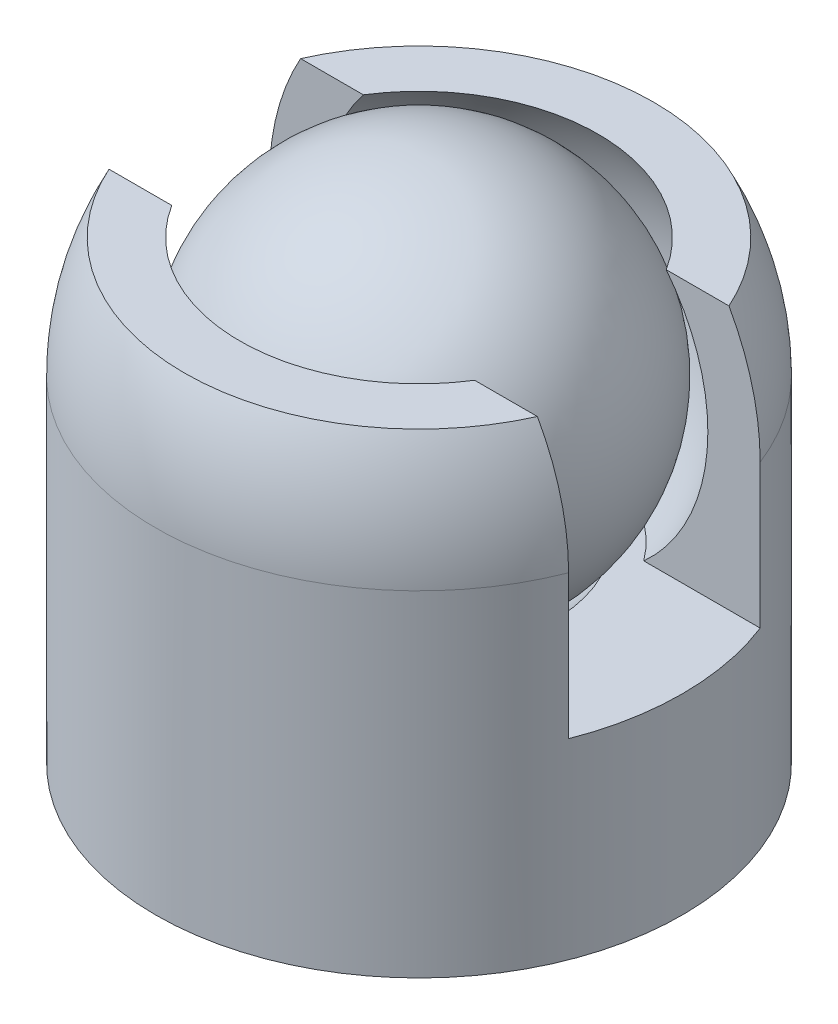
ISO-10303-21;
HEADER;
FILE_DESCRIPTION(('STEP AP214'),'2;1');
FILE_NAME('part.step','',(''),(''),'','','');
FILE_SCHEMA(('AUTOMOTIVE_DESIGN { 1 0 10303 214 1 1 1 1 }'));
ENDSEC;
DATA;
#1=APPLICATION_CONTEXT('core data for automotive mechanical design processes');
#2=APPLICATION_PROTOCOL_DEFINITION('international standard','automotive_design',2000,#1);
#3=PRODUCT_CONTEXT('',#1,'mechanical');
#4=PRODUCT('Part','Part','',(#3));
#5=PRODUCT_RELATED_PRODUCT_CATEGORY('part','',(#4));
#6=PRODUCT_DEFINITION_FORMATION('','',#4);
#7=PRODUCT_DEFINITION_CONTEXT('part definition',#1,'design');
#8=PRODUCT_DEFINITION('design','',#6,#7);
#9=PRODUCT_DEFINITION_SHAPE('','',#8);
#10=(LENGTH_UNIT() NAMED_UNIT(*) SI_UNIT(.MILLI.,.METRE.));
#11=(NAMED_UNIT(*) PLANE_ANGLE_UNIT() SI_UNIT($,.RADIAN.));
#12=(NAMED_UNIT(*) SI_UNIT($,.STERADIAN.) SOLID_ANGLE_UNIT());
#13=UNCERTAINTY_MEASURE_WITH_UNIT(LENGTH_MEASURE(1.E-05),#10,'distance_accuracy_value','');
#14=(GEOMETRIC_REPRESENTATION_CONTEXT(3) GLOBAL_UNCERTAINTY_ASSIGNED_CONTEXT((#13)) GLOBAL_UNIT_ASSIGNED_CONTEXT((#10,
#11,#12)) REPRESENTATION_CONTEXT('',''));
#15=CARTESIAN_POINT('',(0.,0.,0.));
#16=DIRECTION('',(0.,0.,1.));
#17=DIRECTION('',(1.,0.,0.));
#18=AXIS2_PLACEMENT_3D('',#15,#16,#17);
#19=CARTESIAN_POINT('',(0.,7.,0.));
#20=DIRECTION('',(0.,1.,0.));
#21=DIRECTION('',(0.,0.,-1.));
#22=AXIS2_PLACEMENT_3D('',#19,#20,#21);
#23=SPHERICAL_SURFACE('',#22,4.);
#24=CARTESIAN_POINT('',(0.,11.,0.));
#25=VERTEX_POINT('',#24);
#26=VERTEX_LOOP('',#25);
#27=FACE_BOUND('',#26,.T.);
#28=ADVANCED_FACE('F48',(#27),#23,.T.);
#29=CLOSED_SHELL('',(#28));
#30=MANIFOLD_SOLID_BREP('B2',#29);
#31=CARTESIAN_POINT('',(0.,4.,0.));
#32=DIRECTION('',(0.,1.,0.));
#33=DIRECTION('',(0.,0.,1.));
#34=AXIS2_PLACEMENT_3D('',#31,#32,#33);
#35=PLANE('',#34);
#36=CARTESIAN_POINT('',(0.,4.,0.));
#37=DIRECTION('',(0.,1.,0.));
#38=DIRECTION('',(0.,0.,1.));
#39=AXIS2_PLACEMENT_3D('',#36,#37,#38);
#40=CIRCLE('',#39,2.82842712474619);
#41=CARTESIAN_POINT('',(-2.82842712474619,4.,0.));
#42=VERTEX_POINT('',#41);
#43=EDGE_CURVE('E213',#42,#42,#40,.T.);
#44=ORIENTED_EDGE('',*,*,#43,.F.);
#45=EDGE_LOOP('',(#44));
#46=FACE_BOUND('',#45,.T.);
#47=DIRECTION('',(1.,0.,0.));
#48=VECTOR('',#47,1.);
#49=CARTESIAN_POINT('',(-8.5,4.,2.));
#50=LINE('',#49,#48);
#51=CARTESIAN_POINT('',(2.69258240356725,4.,2.));
#52=VERTEX_POINT('',#51);
#53=CARTESIAN_POINT('',(5.1234753829798,4.,2.));
#54=VERTEX_POINT('',#53);
#55=EDGE_CURVE('E169',#52,#54,#50,.T.);
#56=ORIENTED_EDGE('',*,*,#55,.T.);
#57=CARTESIAN_POINT('',(0.,4.,0.));
#58=DIRECTION('',(0.,1.,0.));
#59=DIRECTION('',(0.,0.,1.));
#60=AXIS2_PLACEMENT_3D('',#57,#58,#59);
#61=CIRCLE('',#60,5.5);
#62=CARTESIAN_POINT('',(5.1234753829798,4.,-2.));
#63=VERTEX_POINT('',#62);
#64=EDGE_CURVE('E150',#54,#63,#61,.T.);
#65=ORIENTED_EDGE('',*,*,#64,.T.);
#66=DIRECTION('',(1.,0.,0.));
#67=VECTOR('',#66,1.);
#68=CARTESIAN_POINT('',(-8.5,4.,-2.));
#69=LINE('',#68,#67);
#70=CARTESIAN_POINT('',(2.69258240356725,4.,-2.));
#71=VERTEX_POINT('',#70);
#72=EDGE_CURVE('E162',#71,#63,#69,.T.);
#73=ORIENTED_EDGE('',*,*,#72,.F.);
#74=CARTESIAN_POINT('',(0.,4.,0.));
#75=DIRECTION('',(0.,1.,0.));
#76=DIRECTION('',(0.,0.,1.));
#77=AXIS2_PLACEMENT_3D('',#74,#75,#76);
#78=CIRCLE('',#77,3.35410196624968);
#79=CARTESIAN_POINT('',(-2.69258240356725,4.,-2.));
#80=VERTEX_POINT('',#79);
#81=EDGE_CURVE('E161',#71,#80,#78,.T.);
#82=ORIENTED_EDGE('',*,*,#81,.T.);
#83=CARTESIAN_POINT('',(-5.1234753829798,4.,-2.));
#84=VERTEX_POINT('',#83);
#85=EDGE_CURVE('E153',#84,#80,#69,.T.);
#86=ORIENTED_EDGE('',*,*,#85,.F.);
#87=CARTESIAN_POINT('',(-5.1234753829798,4.,2.));
#88=VERTEX_POINT('',#87);
#89=EDGE_CURVE('E138',#84,#88,#61,.T.);
#90=ORIENTED_EDGE('',*,*,#89,.T.);
#91=CARTESIAN_POINT('',(-2.69258240356725,4.,2.));
#92=VERTEX_POINT('',#91);
#93=EDGE_CURVE('E167',#88,#92,#50,.T.);
#94=ORIENTED_EDGE('',*,*,#93,.T.);
#95=EDGE_CURVE('E199',#92,#52,#78,.T.);
#96=ORIENTED_EDGE('',*,*,#95,.T.);
#97=EDGE_LOOP('',(#56,#65,#73,#82,#86,#90,#94,#96));
#98=FACE_BOUND('',#97,.T.);
#99=ADVANCED_FACE('F61',(#46,#98),#35,.T.);
#100=CARTESIAN_POINT('',(0.,0.,0.));
#101=DIRECTION('',(0.,1.,0.));
#102=DIRECTION('',(0.,0.,1.));
#103=AXIS2_PLACEMENT_3D('',#100,#101,#102);
#104=PLANE('',#103);
#105=CARTESIAN_POINT('',(0.,0.,0.));
#106=DIRECTION('',(0.,1.,0.));
#107=DIRECTION('',(0.,0.,1.));
#108=AXIS2_PLACEMENT_3D('',#105,#106,#107);
#109=CIRCLE('',#108,1.25);
#110=CARTESIAN_POINT('',(0.,0.,1.25));
#111=VERTEX_POINT('',#110);
#112=EDGE_CURVE('E202',#111,#111,#109,.T.);
#113=ORIENTED_EDGE('',*,*,#112,.T.);
#114=EDGE_LOOP('',(#113));
#115=FACE_BOUND('',#114,.T.);
#116=CARTESIAN_POINT('',(0.,0.,0.));
#117=DIRECTION('',(0.,1.,0.));
#118=DIRECTION('',(0.,0.,1.));
#119=AXIS2_PLACEMENT_3D('',#116,#117,#118);
#120=CIRCLE('',#119,5.5);
#121=CARTESIAN_POINT('',(0.,0.,5.5));
#122=VERTEX_POINT('',#121);
#123=EDGE_CURVE('E209',#122,#122,#120,.T.);
#124=ORIENTED_EDGE('',*,*,#123,.F.);
#125=EDGE_LOOP('',(#124));
#126=FACE_BOUND('',#125,.T.);
#127=ADVANCED_FACE('F257',(#115,#126),#104,.F.);
#128=CARTESIAN_POINT('',(0.,7.,0.));
#129=DIRECTION('',(0.,1.,0.));
#130=DIRECTION('',(0.,0.,-1.));
#131=AXIS2_PLACEMENT_3D('',#128,#129,#130);
#132=SPHERICAL_SURFACE('',#131,4.5);
#133=ORIENTED_EDGE('',*,*,#95,.F.);
#134=CARTESIAN_POINT('',(0.,7.,2.));
#135=DIRECTION('',(0.,0.,1.));
#136=DIRECTION('',(1.,0.,0.));
#137=AXIS2_PLACEMENT_3D('',#134,#135,#136);
#138=CIRCLE('',#137,4.03112887414927);
#139=CARTESIAN_POINT('',(-3.16227766016838,9.5,2.));
#140=VERTEX_POINT('',#139);
#141=EDGE_CURVE('E186',#92,#140,#138,.F.);
#142=ORIENTED_EDGE('',*,*,#141,.T.);
#143=CARTESIAN_POINT('',(0.,9.5,0.));
#144=DIRECTION('',(0.,1.,0.));
#145=DIRECTION('',(0.,0.,1.));
#146=AXIS2_PLACEMENT_3D('',#143,#144,#145);
#147=CIRCLE('',#146,3.74165738677394);
#148=CARTESIAN_POINT('',(3.16227766016838,9.5,2.));
#149=VERTEX_POINT('',#148);
#150=EDGE_CURVE('E187',#140,#149,#147,.T.);
#151=ORIENTED_EDGE('',*,*,#150,.T.);
#152=EDGE_CURVE('E183',#149,#52,#138,.F.);
#153=ORIENTED_EDGE('',*,*,#152,.T.);
#154=EDGE_LOOP('',(#133,#142,#151,#153));
#155=FACE_BOUND('',#154,.T.);
#156=ADVANCED_FACE('F263',(#155),#132,.F.);
#157=CARTESIAN_POINT('',(0.,7.,0.));
#158=DIRECTION('',(0.,1.,0.));
#159=DIRECTION('',(0.,0.,-1.));
#160=AXIS2_PLACEMENT_3D('',#157,#158,#159);
#161=SPHERICAL_SURFACE('',#160,5.5);
#162=CARTESIAN_POINT('',(0.,7.,0.));
#163=DIRECTION('',(0.,1.,0.));
#164=DIRECTION('',(0.,0.,1.));
#165=AXIS2_PLACEMENT_3D('',#162,#163,#164);
#166=CIRCLE('',#165,5.5);
#167=CARTESIAN_POINT('',(-5.1234753829798,7.,2.));
#168=VERTEX_POINT('',#167);
#169=CARTESIAN_POINT('',(5.1234753829798,7.,2.));
#170=VERTEX_POINT('',#169);
#171=EDGE_CURVE('E195',#168,#170,#166,.T.);
#172=ORIENTED_EDGE('',*,*,#171,.T.);
#173=CARTESIAN_POINT('',(0.,7.,2.));
#174=DIRECTION('',(0.,0.,1.));
#175=DIRECTION('',(1.,0.,0.));
#176=AXIS2_PLACEMENT_3D('',#173,#174,#175);
#177=CIRCLE('',#176,5.1234753829798);
#178=CARTESIAN_POINT('',(4.47213595499958,9.5,2.));
#179=VERTEX_POINT('',#178);
#180=EDGE_CURVE('E178',#170,#179,#177,.T.);
#181=ORIENTED_EDGE('',*,*,#180,.T.);
#182=CARTESIAN_POINT('',(0.,9.5,0.));
#183=DIRECTION('',(0.,1.,0.));
#184=DIRECTION('',(0.,0.,1.));
#185=AXIS2_PLACEMENT_3D('',#182,#183,#184);
#186=CIRCLE('',#185,4.89897948556635);
#187=CARTESIAN_POINT('',(-4.47213595499958,9.5,2.));
#188=VERTEX_POINT('',#187);
#189=EDGE_CURVE('E191',#188,#179,#186,.T.);
#190=ORIENTED_EDGE('',*,*,#189,.F.);
#191=EDGE_CURVE('E175',#188,#168,#177,.T.);
#192=ORIENTED_EDGE('',*,*,#191,.T.);
#193=EDGE_LOOP('',(#172,#181,#190,#192));
#194=FACE_BOUND('',#193,.T.);
#195=ADVANCED_FACE('F235',(#194),#161,.T.);
#196=CARTESIAN_POINT('',(0.,9.5,-3.74165738677394));
#197=DIRECTION('',(0.,-1.,0.));
#198=DIRECTION('',(0.,0.,-1.));
#199=AXIS2_PLACEMENT_3D('',#196,#197,#198);
#200=PLANE('',#199);
#201=ORIENTED_EDGE('',*,*,#189,.T.);
#202=DIRECTION('',(-1.,0.,0.));
#203=VECTOR('',#202,1.);
#204=CARTESIAN_POINT('',(0.,9.5,2.));
#205=LINE('',#204,#203);
#206=EDGE_CURVE('E46',#179,#149,#205,.T.);
#207=ORIENTED_EDGE('',*,*,#206,.T.);
#208=ORIENTED_EDGE('',*,*,#150,.F.);
#209=EDGE_CURVE('E65',#140,#188,#205,.T.);
#210=ORIENTED_EDGE('',*,*,#209,.T.);
#211=EDGE_LOOP('',(#201,#207,#208,#210));
#212=FACE_BOUND('',#211,.T.);
#213=ADVANCED_FACE('F230',(#212),#200,.F.);
#214=CARTESIAN_POINT('',(0.,4.,0.));
#215=DIRECTION('',(0.,-1.,0.));
#216=DIRECTION('',(0.,0.,-1.));
#217=AXIS2_PLACEMENT_3D('',#214,#215,#216);
#218=CYLINDRICAL_SURFACE('',#217,5.5);
#219=ORIENTED_EDGE('',*,*,#123,.T.);
#220=EDGE_LOOP('',(#219));
#221=FACE_BOUND('',#220,.T.);
#222=CARTESIAN_POINT('',(5.1234753829798,7.,-2.));
#223=VERTEX_POINT('',#222);
#224=CARTESIAN_POINT('',(-5.1234753829798,7.,-2.));
#225=VERTEX_POINT('',#224);
#226=EDGE_CURVE('E198',#223,#225,#166,.T.);
#227=ORIENTED_EDGE('',*,*,#226,.F.);
#228=DIRECTION('',(0.,-1.,0.));
#229=VECTOR('',#228,1.);
#230=CARTESIAN_POINT('',(5.1234753829798,4.,-2.));
#231=LINE('',#230,#229);
#232=EDGE_CURVE('E164',#223,#63,#231,.T.);
#233=ORIENTED_EDGE('',*,*,#232,.T.);
#234=ORIENTED_EDGE('',*,*,#64,.F.);
#235=DIRECTION('',(0.,-1.,0.));
#236=VECTOR('',#235,1.);
#237=CARTESIAN_POINT('',(5.1234753829798,4.,2.));
#238=LINE('',#237,#236);
#239=EDGE_CURVE('E180',#54,#170,#238,.F.);
#240=ORIENTED_EDGE('',*,*,#239,.T.);
#241=ORIENTED_EDGE('',*,*,#171,.F.);
#242=DIRECTION('',(0.,-1.,0.));
#243=VECTOR('',#242,1.);
#244=CARTESIAN_POINT('',(-5.1234753829798,4.,2.));
#245=LINE('',#244,#243);
#246=EDGE_CURVE('E145',#168,#88,#245,.T.);
#247=ORIENTED_EDGE('',*,*,#246,.T.);
#248=ORIENTED_EDGE('',*,*,#89,.F.);
#249=DIRECTION('',(0.,-1.,0.));
#250=VECTOR('',#249,1.);
#251=CARTESIAN_POINT('',(-5.1234753829798,4.,-2.));
#252=LINE('',#251,#250);
#253=EDGE_CURVE('E142',#84,#225,#252,.F.);
#254=ORIENTED_EDGE('',*,*,#253,.T.);
#255=EDGE_LOOP('',(#227,#233,#234,#240,#241,#247,#248,#254));
#256=FACE_BOUND('',#255,.T.);
#257=ADVANCED_FACE('F141',(#221,#256),#218,.T.);
#258=CARTESIAN_POINT('',(0.,7.5,0.));
#259=DIRECTION('',(0.,-1.,0.));
#260=DIRECTION('',(-1.,0.,0.));
#261=AXIS2_PLACEMENT_3D('',#258,#259,#260);
#262=SPHERICAL_SURFACE('',#261,4.5);
#263=CARTESIAN_POINT('',(0.,3.46887112585072,0.));
#264=DIRECTION('',(0.,1.,0.));
#265=DIRECTION('',(0.,0.,1.));
#266=AXIS2_PLACEMENT_3D('',#263,#264,#265);
#267=CIRCLE('',#266,2.);
#268=CARTESIAN_POINT('',(-2.,3.46887112585072,0.));
#269=VERTEX_POINT('',#268);
#270=EDGE_CURVE('E205',#269,#269,#267,.F.);
#271=CARTESIAN_POINT('',(-2.,3.46887112585072,0.));
#272=CARTESIAN_POINT('',(-2.00920104466703,3.4734361217226,0.));
#273=CARTESIAN_POINT('',(-2.01838645941678,3.47803262068411,0.));
#274=CARTESIAN_POINT('',(-2.03672559956785,3.48728840694385,0.));
#275=CARTESIAN_POINT('',(-2.04587932496917,3.49194769424209,0.));
#276=CARTESIAN_POINT('',(-2.06415465690951,3.5013288393328,0.));
#277=CARTESIAN_POINT('',(-2.07327626344854,3.50605069712527,0.));
#278=CARTESIAN_POINT('',(-2.09148693005455,3.51555676163925,0.));
#279=CARTESIAN_POINT('',(-2.10057599012154,3.52034096836078,0.));
#280=CARTESIAN_POINT('',(-2.11872113759309,3.52997150645567,0.));
#281=CARTESIAN_POINT('',(-2.12777722499766,3.53481783782903,0.));
#282=CARTESIAN_POINT('',(-2.14585600252859,3.54457239798086,0.));
#283=CARTESIAN_POINT('',(-2.15487869265495,3.54948062675932,0.));
#284=CARTESIAN_POINT('',(-2.17289025257198,3.55935875158752,0.));
#285=CARTESIAN_POINT('',(-2.18187912236264,3.56432864763726,0.));
#286=CARTESIAN_POINT('',(-2.19982262013857,3.57432987397866,0.));
#287=CARTESIAN_POINT('',(-2.20877724812384,3.57936120427034,0.));
#288=CARTESIAN_POINT('',(-2.22665184242428,3.58948506318683,0.));
#289=CARTESIAN_POINT('',(-2.23557180873945,3.59457759181166,0.));
#290=CARTESIAN_POINT('',(-2.25337666146037,3.60482360861592,0.));
#291=CARTESIAN_POINT('',(-2.2622615478661,3.60997709679536,0.));
#292=CARTESIAN_POINT('',(-2.27999582417359,3.62034479107212,0.));
#293=CARTESIAN_POINT('',(-2.28884521407534,3.62555899716945,0.));
#294=CARTESIAN_POINT('',(-2.30650808244466,3.63604788279828,0.));
#295=CARTESIAN_POINT('',(-2.31532156091223,3.64132256232979,0.));
#296=CARTESIAN_POINT('',(-2.33291219316683,3.65193214750783,0.));
#297=CARTESIAN_POINT('',(-2.34168934695386,3.65726705315436,0.));
#298=CARTESIAN_POINT('',(-2.35920691830419,3.66799684041938,0.));
#299=CARTESIAN_POINT('',(-2.36794733586749,3.67339172203788,0.));
#300=CARTESIAN_POINT('',(-2.38539102494969,3.68424120829163,0.));
#301=CARTESIAN_POINT('',(-2.39409429646857,3.68969581292689,0.));
#302=CARTESIAN_POINT('',(-2.41146328538295,3.70066448945868,0.));
#303=CARTESIAN_POINT('',(-2.42012900277844,3.70617856135521,0.));
#304=CARTESIAN_POINT('',(-2.43742247712786,3.71726591386573,0.));
#305=CARTESIAN_POINT('',(-2.44605023408179,3.72283919447972,0.));
#306=CARTESIAN_POINT('',(-2.46326738300985,3.7340447031052,0.));
#307=CARTESIAN_POINT('',(-2.47185677498398,3.73967693111669,0.));
#308=CARTESIAN_POINT('',(-2.48899679121301,3.75100007045325,0.));
#309=CARTESIAN_POINT('',(-2.49754741546792,3.75669098177832,0.));
#310=CARTESIAN_POINT('',(-2.51460949533685,3.76813122090662,0.));
#311=CARTESIAN_POINT('',(-2.52312095095089,3.77388054870984,0.));
#312=CARTESIAN_POINT('',(-2.54010429445295,3.78543735121995,0.));
#313=CARTESIAN_POINT('',(-2.54857618234098,3.79124482592683,0.));
#314=CARTESIAN_POINT('',(-2.56547999316117,3.80291764994341,0.));
#315=CARTESIAN_POINT('',(-2.57391191609333,3.80878299925309,0.));
#316=CARTESIAN_POINT('',(-2.59073540164577,3.82057129746077,0.));
#317=CARTESIAN_POINT('',(-2.59912696426606,3.82649424635877,0.));
#318=CARTESIAN_POINT('',(-2.6158693357312,3.83839746602783,0.));
#319=CARTESIAN_POINT('',(-2.62422014457606,3.8443777367989,0.));
#320=CARTESIAN_POINT('',(-2.64088061693756,3.85639531981122,0.));
#321=CARTESIAN_POINT('',(-2.64919028045421,3.86243263205248,0.));
#322=CARTESIAN_POINT('',(-2.66576807253598,3.87456401492751,0.));
#323=CARTESIAN_POINT('',(-2.6740362011011,3.88065808556127,0.));
#324=CARTESIAN_POINT('',(-2.69053053560319,3.89290269948328,0.));
#325=CARTESIAN_POINT('',(-2.69875674154017,3.89905324277152,0.));
#326=CARTESIAN_POINT('',(-2.7151668450779,3.911410513613,0.));
#327=CARTESIAN_POINT('',(-2.72335074267864,3.91761724116624,0.));
#328=CARTESIAN_POINT('',(-2.73967584580895,3.93008658952717,0.));
#329=CARTESIAN_POINT('',(-2.74781705133852,3.93634921033486,0.));
#330=CARTESIAN_POINT('',(-2.76405638863282,3.9489300515238,0.));
#331=CARTESIAN_POINT('',(-2.77215452039756,3.95524827190505,0.));
#332=CARTESIAN_POINT('',(-2.78830733034064,3.96794001613842,0.));
#333=CARTESIAN_POINT('',(-2.79636200851898,3.97431353999056,0.));
#334=CARTESIAN_POINT('',(-2.81242753405582,3.98711559177891,0.));
#335=CARTESIAN_POINT('',(-2.82043838141433,3.99354411971513,0.));
#336=CARTESIAN_POINT('',(-2.82842712474619,4.,0.));
#337=B_SPLINE_CURVE_WITH_KNOTS('',3,(#271,#272,#273,#274,#275,#276,#277,#278,#279,#280,#281,
#282,#283,#284,#285,#286,#287,#288,#289,#290,#291,#292,#293,#294,#295,#296,#297,#298,#299,#300,
#301,#302,#303,#304,#305,#306,#307,#308,#309,#310,#311,#312,#313,#314,#315,#316,#317,#318,#319,
#320,#321,#322,#323,#324,#325,#326,#327,#328,#329,#330,#331,#332,#333,#334,#335,#336),
.UNSPECIFIED.,.F.,.F.,(4,2,2,2,2,2,2,2,2,2,2,2,2,2,2,2,2,2,2,2,2,2,2,2,2,2,2,2,2,2,2,2,4),(0.,
0.030813665503838,0.061627331007677,0.0924409965115149,0.123254662015354,0.154068327519192,
0.18488199302303,0.215695658526869,0.246509324030707,0.277322989534545,0.308136655038384,
0.338950320542221,0.36976398604606,0.400577651549898,0.431391317053737,0.462204982557575,
0.493018648061413,0.523832313565252,0.55464597906909,0.585459644572928,0.616273310076766,
0.647086975580605,0.677900641084443,0.708714306588282,0.73952797209212,0.770341637595958,
0.801155303099797,0.831968968603635,0.862782634107474,0.893596299611312,0.92440996511515,
0.955223630618989,0.986037296122827),.UNSPECIFIED.);
#338=EDGE_CURVE('BSEAM268',#269,#42,#337,.T.);
#339=ORIENTED_EDGE('',*,*,#270,.T.);
#340=ORIENTED_EDGE('',*,*,#43,.T.);
#341=ORIENTED_EDGE('',*,*,#338,.T.);
#342=ORIENTED_EDGE('',*,*,#338,.F.);
#343=EDGE_LOOP('',(#339,#341,#340,#342));
#344=FACE_BOUND('',#343,.T.);
#345=ADVANCED_FACE('F268',(#344),#262,.F.);
#346=CARTESIAN_POINT('',(0.,1.5,0.));
#347=DIRECTION('',(0.,1.,0.));
#348=DIRECTION('',(0.,0.,1.));
#349=AXIS2_PLACEMENT_3D('',#346,#347,#348);
#350=CYLINDRICAL_SURFACE('',#349,2.);
#351=CARTESIAN_POINT('',(0.,2.25,0.));
#352=DIRECTION('',(0.,1.,0.));
#353=DIRECTION('',(0.,0.,1.));
#354=AXIS2_PLACEMENT_3D('',#351,#352,#353);
#355=CIRCLE('',#354,2.);
#356=CARTESIAN_POINT('',(0.,2.25,2.));
#357=VERTEX_POINT('',#356);
#358=EDGE_CURVE('E212',#357,#357,#355,.F.);
#359=ORIENTED_EDGE('',*,*,#358,.T.);
#360=EDGE_LOOP('',(#359));
#361=FACE_BOUND('',#360,.T.);
#362=ORIENTED_EDGE('',*,*,#270,.F.);
#363=EDGE_LOOP('',(#362));
#364=FACE_BOUND('',#363,.T.);
#365=ADVANCED_FACE('F275',(#361,#364),#350,.F.);
#366=CARTESIAN_POINT('',(0.,0.,0.));
#367=DIRECTION('',(0.,1.,0.));
#368=DIRECTION('',(0.,0.,1.));
#369=AXIS2_PLACEMENT_3D('',#366,#367,#368);
#370=CYLINDRICAL_SURFACE('',#369,1.25);
#371=ORIENTED_EDGE('',*,*,#112,.F.);
#372=EDGE_LOOP('',(#371));
#373=FACE_BOUND('',#372,.T.);
#374=CARTESIAN_POINT('',(0.,1.5,0.));
#375=DIRECTION('',(0.,1.,0.));
#376=DIRECTION('',(0.,0.,1.));
#377=AXIS2_PLACEMENT_3D('',#374,#375,#376);
#378=CIRCLE('',#377,1.25);
#379=CARTESIAN_POINT('',(0.,1.5,1.25));
#380=VERTEX_POINT('',#379);
#381=EDGE_CURVE('E206',#380,#380,#378,.T.);
#382=ORIENTED_EDGE('',*,*,#381,.T.);
#383=EDGE_LOOP('',(#382));
#384=FACE_BOUND('',#383,.T.);
#385=ADVANCED_FACE('F282',(#373,#384),#370,.F.);
#386=CARTESIAN_POINT('',(0.,2.25,0.));
#387=DIRECTION('',(0.,1.,0.));
#388=DIRECTION('',(0.,0.,1.));
#389=AXIS2_PLACEMENT_3D('',#386,#387,#388);
#390=TOROIDAL_SURFACE('',#389,1.25,0.75);
#391=ORIENTED_EDGE('',*,*,#358,.F.);
#392=EDGE_LOOP('',(#391));
#393=FACE_BOUND('',#392,.T.);
#394=ORIENTED_EDGE('',*,*,#381,.F.);
#395=EDGE_LOOP('',(#394));
#396=FACE_BOUND('',#395,.T.);
#397=ADVANCED_FACE('F63',(#393,#396),#390,.F.);
#398=ORIENTED_EDGE('',*,*,#81,.F.);
#399=CARTESIAN_POINT('',(0.,7.,-2.));
#400=DIRECTION('',(0.,0.,-1.));
#401=DIRECTION('',(-1.,0.,0.));
#402=AXIS2_PLACEMENT_3D('',#399,#400,#401);
#403=CIRCLE('',#402,4.03112887414927);
#404=CARTESIAN_POINT('',(3.16227766016838,9.5,-2.));
#405=VERTEX_POINT('',#404);
#406=EDGE_CURVE('E174',#71,#405,#403,.F.);
#407=ORIENTED_EDGE('',*,*,#406,.T.);
#408=CARTESIAN_POINT('',(-3.16227766016838,9.5,-2.));
#409=VERTEX_POINT('',#408);
#410=EDGE_CURVE('E190',#405,#409,#147,.T.);
#411=ORIENTED_EDGE('',*,*,#410,.T.);
#412=EDGE_CURVE('E84',#409,#80,#403,.F.);
#413=ORIENTED_EDGE('',*,*,#412,.T.);
#414=EDGE_LOOP('',(#398,#407,#411,#413));
#415=FACE_BOUND('',#414,.T.);
#416=ADVANCED_FACE('F242',(#415),#132,.F.);
#417=ORIENTED_EDGE('',*,*,#226,.T.);
#418=CARTESIAN_POINT('',(0.,7.,-2.));
#419=DIRECTION('',(0.,0.,-1.));
#420=DIRECTION('',(-1.,0.,0.));
#421=AXIS2_PLACEMENT_3D('',#418,#419,#420);
#422=CIRCLE('',#421,5.1234753829798);
#423=CARTESIAN_POINT('',(-4.47213595499958,9.5,-2.));
#424=VERTEX_POINT('',#423);
#425=EDGE_CURVE('E155',#225,#424,#422,.T.);
#426=ORIENTED_EDGE('',*,*,#425,.T.);
#427=CARTESIAN_POINT('',(4.47213595499958,9.5,-2.));
#428=VERTEX_POINT('',#427);
#429=EDGE_CURVE('E194',#428,#424,#186,.T.);
#430=ORIENTED_EDGE('',*,*,#429,.F.);
#431=EDGE_CURVE('E76',#428,#223,#422,.T.);
#432=ORIENTED_EDGE('',*,*,#431,.T.);
#433=EDGE_LOOP('',(#417,#426,#430,#432));
#434=FACE_BOUND('',#433,.T.);
#435=ADVANCED_FACE('F245',(#434),#161,.T.);
#436=ORIENTED_EDGE('',*,*,#429,.T.);
#437=DIRECTION('',(1.,0.,0.));
#438=VECTOR('',#437,1.);
#439=CARTESIAN_POINT('',(0.,9.5,-2.));
#440=LINE('',#439,#438);
#441=EDGE_CURVE('E220',#424,#409,#440,.T.);
#442=ORIENTED_EDGE('',*,*,#441,.T.);
#443=ORIENTED_EDGE('',*,*,#410,.F.);
#444=EDGE_CURVE('E219',#405,#428,#440,.T.);
#445=ORIENTED_EDGE('',*,*,#444,.T.);
#446=EDGE_LOOP('',(#436,#442,#443,#445));
#447=FACE_BOUND('',#446,.T.);
#448=ADVANCED_FACE('F243',(#447),#200,.F.);
#449=CARTESIAN_POINT('',(-8.5,4.,2.));
#450=DIRECTION('',(0.,0.,1.));
#451=DIRECTION('',(1.,0.,0.));
#452=AXIS2_PLACEMENT_3D('',#449,#450,#451);
#453=PLANE('',#452);
#454=ORIENTED_EDGE('',*,*,#206,.F.);
#455=ORIENTED_EDGE('',*,*,#180,.F.);
#456=ORIENTED_EDGE('',*,*,#239,.F.);
#457=ORIENTED_EDGE('',*,*,#55,.F.);
#458=ORIENTED_EDGE('',*,*,#152,.F.);
#459=EDGE_LOOP('',(#454,#455,#456,#457,#458));
#460=FACE_BOUND('',#459,.T.);
#461=ADVANCED_FACE('F238',(#460),#453,.F.);
#462=CARTESIAN_POINT('',(-8.5,4.,-2.));
#463=DIRECTION('',(0.,0.,-1.));
#464=DIRECTION('',(-1.,0.,0.));
#465=AXIS2_PLACEMENT_3D('',#462,#463,#464);
#466=PLANE('',#465);
#467=ORIENTED_EDGE('',*,*,#72,.T.);
#468=ORIENTED_EDGE('',*,*,#232,.F.);
#469=ORIENTED_EDGE('',*,*,#431,.F.);
#470=ORIENTED_EDGE('',*,*,#444,.F.);
#471=ORIENTED_EDGE('',*,*,#406,.F.);
#472=EDGE_LOOP('',(#467,#468,#469,#470,#471));
#473=FACE_BOUND('',#472,.T.);
#474=ADVANCED_FACE('F239',(#473),#466,.F.);
#475=ORIENTED_EDGE('',*,*,#93,.F.);
#476=ORIENTED_EDGE('',*,*,#246,.F.);
#477=ORIENTED_EDGE('',*,*,#191,.F.);
#478=ORIENTED_EDGE('',*,*,#209,.F.);
#479=ORIENTED_EDGE('',*,*,#141,.F.);
#480=EDGE_LOOP('',(#475,#476,#477,#478,#479));
#481=FACE_BOUND('',#480,.T.);
#482=ADVANCED_FACE('F252',(#481),#453,.F.);
#483=ORIENTED_EDGE('',*,*,#441,.F.);
#484=ORIENTED_EDGE('',*,*,#425,.F.);
#485=ORIENTED_EDGE('',*,*,#253,.F.);
#486=ORIENTED_EDGE('',*,*,#85,.T.);
#487=ORIENTED_EDGE('',*,*,#412,.F.);
#488=EDGE_LOOP('',(#483,#484,#485,#486,#487));
#489=FACE_BOUND('',#488,.T.);
#490=ADVANCED_FACE('F152',(#489),#466,.F.);
#491=CLOSED_SHELL('',(#99,#127,#156,#195,#213,#257,#345,#365,#385,#397,#416,#435,#448,#461,#474,
#482,#490));
#492=MANIFOLD_SOLID_BREP('B7',#491);
#493=ADVANCED_BREP_SHAPE_REPRESENTATION('',(#18,#30,#492),#14);
#494=SHAPE_DEFINITION_REPRESENTATION(#9,#493);
ENDSEC;
END-ISO-10303-21;
